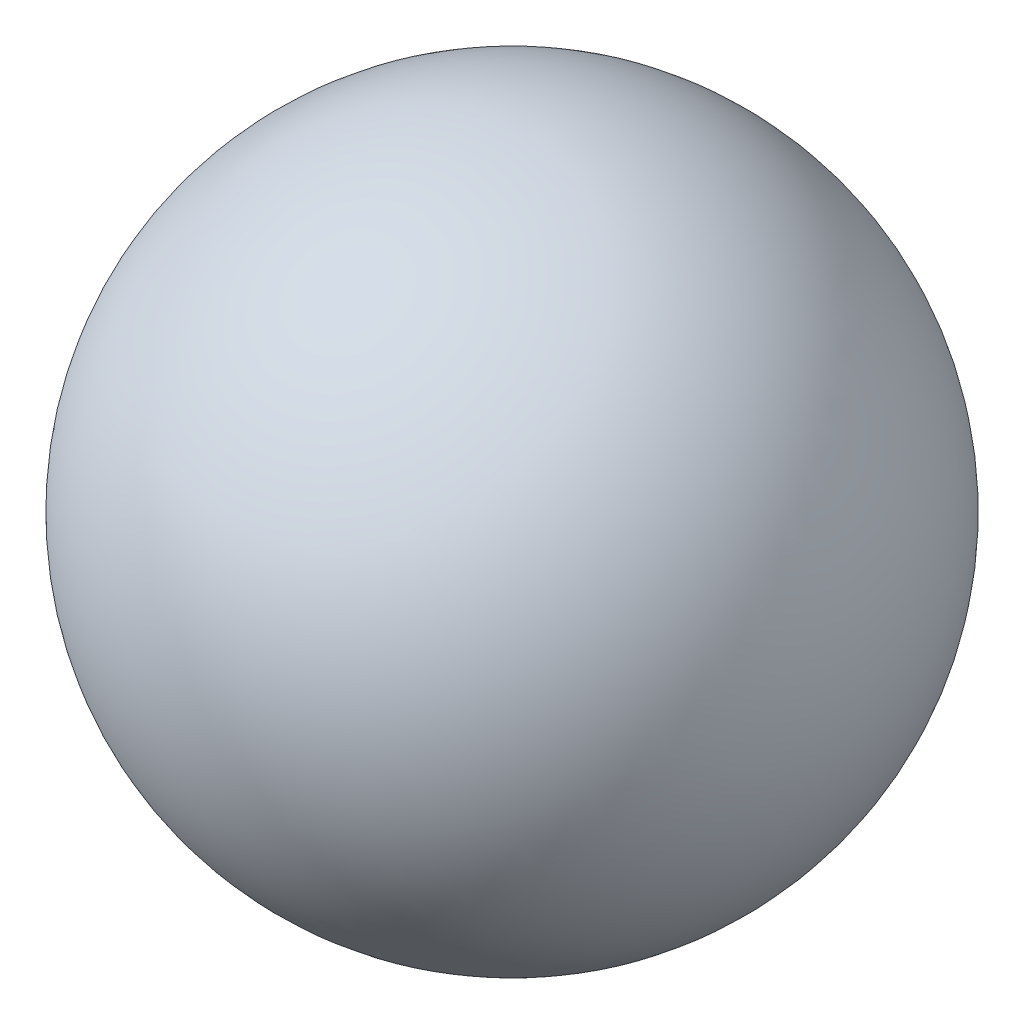
ISO-10303-21;
HEADER;
FILE_DESCRIPTION(('STEP AP214'),'2;1');
FILE_NAME('part.step','',(''),(''),'','','');
FILE_SCHEMA(('AUTOMOTIVE_DESIGN { 1 0 10303 214 1 1 1 1 }'));
ENDSEC;
DATA;
#1=APPLICATION_CONTEXT('core data for automotive mechanical design processes');
#2=APPLICATION_PROTOCOL_DEFINITION('international standard','automotive_design',2000,#1);
#3=PRODUCT_CONTEXT('',#1,'mechanical');
#4=PRODUCT('Part','Part','',(#3));
#5=PRODUCT_RELATED_PRODUCT_CATEGORY('part','',(#4));
#6=PRODUCT_DEFINITION_FORMATION('','',#4);
#7=PRODUCT_DEFINITION_CONTEXT('part definition',#1,'design');
#8=PRODUCT_DEFINITION('design','',#6,#7);
#9=PRODUCT_DEFINITION_SHAPE('','',#8);
#10=(LENGTH_UNIT() NAMED_UNIT(*) SI_UNIT(.MILLI.,.METRE.));
#11=(NAMED_UNIT(*) PLANE_ANGLE_UNIT() SI_UNIT($,.RADIAN.));
#12=(NAMED_UNIT(*) SI_UNIT($,.STERADIAN.) SOLID_ANGLE_UNIT());
#13=UNCERTAINTY_MEASURE_WITH_UNIT(LENGTH_MEASURE(1.E-05),#10,'distance_accuracy_value','');
#14=(GEOMETRIC_REPRESENTATION_CONTEXT(3) GLOBAL_UNCERTAINTY_ASSIGNED_CONTEXT((#13)) GLOBAL_UNIT_ASSIGNED_CONTEXT((#10,
#11,#12)) REPRESENTATION_CONTEXT('',''));
#15=CARTESIAN_POINT('',(0.,0.,0.));
#16=DIRECTION('',(0.,0.,1.));
#17=DIRECTION('',(1.,0.,0.));
#18=AXIS2_PLACEMENT_3D('',#15,#16,#17);
#19=CARTESIAN_POINT('',(0.,0.,0.));
#20=DIRECTION('',(0.,1.,0.));
#21=DIRECTION('',(-1.,0.,0.));
#22=AXIS2_PLACEMENT_3D('',#19,#20,#21);
#23=SPHERICAL_SURFACE('',#22,1000.);
#24=CARTESIAN_POINT('',(0.,1000.,0.));
#25=VERTEX_POINT('',#24);
#26=VERTEX_LOOP('',#25);
#27=FACE_BOUND('',#26,.T.);
#28=ADVANCED_FACE('F36',(#27),#23,.T.);
#29=CLOSED_SHELL('',(#28));
#30=CARTESIAN_POINT('',(0.,0.,0.));
#31=DIRECTION('',(0.,1.,0.));
#32=DIRECTION('',(1.,0.,0.));
#33=AXIS2_PLACEMENT_3D('',#30,#31,#32);
#34=SPHERICAL_SURFACE('',#33,800.);
#35=CARTESIAN_POINT('',(0.,800.,0.));
#36=VERTEX_POINT('',#35);
#37=VERTEX_LOOP('',#36);
#38=FACE_BOUND('',#37,.T.);
#39=ADVANCED_FACE('F38',(#38),#34,.F.);
#40=CLOSED_SHELL('',(#39));
#41=ORIENTED_CLOSED_SHELL('',*,#40,.T.);
#42=BREP_WITH_VOIDS('B2',#29,(#41));
#43=ADVANCED_BREP_SHAPE_REPRESENTATION('',(#18,#42),#14);
#44=SHAPE_DEFINITION_REPRESENTATION(#9,#43);
ENDSEC;
END-ISO-10303-21;
